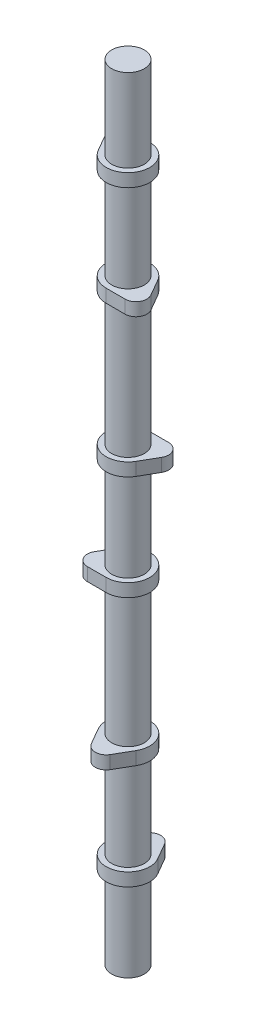
ISO-10303-21;
HEADER;
FILE_DESCRIPTION(('STEP AP214'),'2;1');
FILE_NAME('part.step','',(''),(''),'','','');
FILE_SCHEMA(('AUTOMOTIVE_DESIGN { 1 0 10303 214 1 1 1 1 }'));
ENDSEC;
DATA;
#1=APPLICATION_CONTEXT('core data for automotive mechanical design processes');
#2=APPLICATION_PROTOCOL_DEFINITION('international standard','automotive_design',2000,#1);
#3=PRODUCT_CONTEXT('',#1,'mechanical');
#4=PRODUCT('Part','Part','',(#3));
#5=PRODUCT_RELATED_PRODUCT_CATEGORY('part','',(#4));
#6=PRODUCT_DEFINITION_FORMATION('','',#4);
#7=PRODUCT_DEFINITION_CONTEXT('part definition',#1,'design');
#8=PRODUCT_DEFINITION('design','',#6,#7);
#9=PRODUCT_DEFINITION_SHAPE('','',#8);
#10=(LENGTH_UNIT() NAMED_UNIT(*) SI_UNIT(.MILLI.,.METRE.));
#11=(NAMED_UNIT(*) PLANE_ANGLE_UNIT() SI_UNIT($,.RADIAN.));
#12=(NAMED_UNIT(*) SI_UNIT($,.STERADIAN.) SOLID_ANGLE_UNIT());
#13=UNCERTAINTY_MEASURE_WITH_UNIT(LENGTH_MEASURE(1.E-05),#10,'distance_accuracy_value','');
#14=(GEOMETRIC_REPRESENTATION_CONTEXT(3) GLOBAL_UNCERTAINTY_ASSIGNED_CONTEXT((#13)) GLOBAL_UNIT_ASSIGNED_CONTEXT((#10,
#11,#12)) REPRESENTATION_CONTEXT('',''));
#15=CARTESIAN_POINT('',(0.,0.,0.));
#16=DIRECTION('',(0.,0.,1.));
#17=DIRECTION('',(1.,0.,0.));
#18=AXIS2_PLACEMENT_3D('',#15,#16,#17);
#19=CARTESIAN_POINT('',(0.,405.13,0.));
#20=DIRECTION('',(0.,-1.,0.));
#21=DIRECTION('',(0.,0.,-1.));
#22=AXIS2_PLACEMENT_3D('',#19,#20,#21);
#23=CYLINDRICAL_SURFACE('',#22,9.5);
#24=CARTESIAN_POINT('',(0.,210.82,0.));
#25=DIRECTION('',(0.,1.,0.));
#26=DIRECTION('',(0.,0.,1.));
#27=AXIS2_PLACEMENT_3D('',#24,#25,#26);
#28=CIRCLE('',#27,9.5);
#29=CARTESIAN_POINT('',(0.,210.82,9.5));
#30=VERTEX_POINT('',#29);
#31=EDGE_CURVE('E302',#30,#30,#28,.T.);
#32=ORIENTED_EDGE('',*,*,#31,.T.);
#33=EDGE_LOOP('',(#32));
#34=FACE_BOUND('',#33,.T.);
#35=CARTESIAN_POINT('',(0.,288.29,0.));
#36=DIRECTION('',(0.,1.,0.));
#37=DIRECTION('',(0.,0.,1.));
#38=AXIS2_PLACEMENT_3D('',#35,#36,#37);
#39=CIRCLE('',#38,9.5);
#40=CARTESIAN_POINT('',(0.,288.29,9.5));
#41=VERTEX_POINT('',#40);
#42=EDGE_CURVE('E11',#41,#41,#39,.T.);
#43=ORIENTED_EDGE('',*,*,#42,.F.);
#44=EDGE_LOOP('',(#43));
#45=FACE_BOUND('',#44,.T.);
#46=ADVANCED_FACE('F37',(#34,#45),#23,.T.);
#47=CARTESIAN_POINT('',(0.,149.86,0.));
#48=DIRECTION('',(0.,1.,0.));
#49=DIRECTION('',(0.,0.,1.));
#50=AXIS2_PLACEMENT_3D('',#47,#48,#49);
#51=CIRCLE('',#50,9.5);
#52=CARTESIAN_POINT('',(0.,149.86,9.5));
#53=VERTEX_POINT('',#52);
#54=EDGE_CURVE('E333',#53,#53,#51,.T.);
#55=ORIENTED_EDGE('',*,*,#54,.T.);
#56=EDGE_LOOP('',(#55));
#57=FACE_BOUND('',#56,.T.);
#58=CARTESIAN_POINT('',(0.,203.2,0.));
#59=DIRECTION('',(0.,1.,0.));
#60=DIRECTION('',(0.,0.,1.));
#61=AXIS2_PLACEMENT_3D('',#58,#59,#60);
#62=CIRCLE('',#61,9.5);
#63=CARTESIAN_POINT('',(0.,203.2,9.5));
#64=VERTEX_POINT('',#63);
#65=EDGE_CURVE('E406',#64,#64,#62,.T.);
#66=ORIENTED_EDGE('',*,*,#65,.F.);
#67=EDGE_LOOP('',(#66));
#68=FACE_BOUND('',#67,.T.);
#69=ADVANCED_FACE('F455',(#57,#68),#23,.T.);
#70=CARTESIAN_POINT('',(0.,64.77,0.));
#71=DIRECTION('',(0.,1.,0.));
#72=DIRECTION('',(0.,0.,1.));
#73=AXIS2_PLACEMENT_3D('',#70,#71,#72);
#74=CIRCLE('',#73,9.5);
#75=CARTESIAN_POINT('',(0.,64.77,9.5));
#76=VERTEX_POINT('',#75);
#77=EDGE_CURVE('E364',#76,#76,#74,.T.);
#78=ORIENTED_EDGE('',*,*,#77,.T.);
#79=EDGE_LOOP('',(#78));
#80=FACE_BOUND('',#79,.T.);
#81=CARTESIAN_POINT('',(0.,142.24,0.));
#82=DIRECTION('',(0.,1.,0.));
#83=DIRECTION('',(0.,0.,1.));
#84=AXIS2_PLACEMENT_3D('',#81,#82,#83);
#85=CIRCLE('',#84,9.5);
#86=CARTESIAN_POINT('',(0.,142.24,9.5));
#87=VERTEX_POINT('',#86);
#88=EDGE_CURVE('E401',#87,#87,#85,.T.);
#89=ORIENTED_EDGE('',*,*,#88,.F.);
#90=EDGE_LOOP('',(#89));
#91=FACE_BOUND('',#90,.T.);
#92=ADVANCED_FACE('F464',(#80,#91),#23,.T.);
#93=CARTESIAN_POINT('',(0.,3.80999999999998,0.));
#94=DIRECTION('',(0.,1.,0.));
#95=DIRECTION('',(0.,0.,1.));
#96=AXIS2_PLACEMENT_3D('',#93,#94,#95);
#97=CIRCLE('',#96,9.5);
#98=CARTESIAN_POINT('',(0.,3.80999999999998,9.5));
#99=VERTEX_POINT('',#98);
#100=EDGE_CURVE('E368',#99,#99,#97,.F.);
#101=ORIENTED_EDGE('',*,*,#100,.F.);
#102=EDGE_LOOP('',(#101));
#103=FACE_BOUND('',#102,.T.);
#104=CARTESIAN_POINT('',(0.,57.15,0.));
#105=DIRECTION('',(0.,1.,0.));
#106=DIRECTION('',(0.,0.,1.));
#107=AXIS2_PLACEMENT_3D('',#104,#105,#106);
#108=CIRCLE('',#107,9.5);
#109=CARTESIAN_POINT('',(0.,57.15,9.5));
#110=VERTEX_POINT('',#109);
#111=EDGE_CURVE('E398',#110,#110,#108,.T.);
#112=ORIENTED_EDGE('',*,*,#111,.F.);
#113=EDGE_LOOP('',(#112));
#114=FACE_BOUND('',#113,.T.);
#115=ADVANCED_FACE('F482',(#103,#114),#23,.T.);
#116=CARTESIAN_POINT('',(0.,3.81,-12.7));
#117=DIRECTION('',(0.,-1.,0.));
#118=DIRECTION('',(0.,0.,-1.));
#119=AXIS2_PLACEMENT_3D('',#116,#117,#118);
#120=CYLINDRICAL_SURFACE('',#119,6.35);
#121=CARTESIAN_POINT('',(0.,-3.81,-12.7));
#122=DIRECTION('',(0.,1.,0.));
#123=DIRECTION('',(0.,0.,1.));
#124=AXIS2_PLACEMENT_3D('',#121,#122,#123);
#125=CIRCLE('',#124,6.35);
#126=CARTESIAN_POINT('',(5.49926131403118,-3.81,-15.875));
#127=VERTEX_POINT('',#126);
#128=CARTESIAN_POINT('',(-5.49926131403119,-3.81,-15.875));
#129=VERTEX_POINT('',#128);
#130=EDGE_CURVE('E374',#127,#129,#125,.T.);
#131=ORIENTED_EDGE('',*,*,#130,.T.);
#132=DIRECTION('',(0.,-1.,0.));
#133=VECTOR('',#132,1.);
#134=CARTESIAN_POINT('',(-5.49926131403119,3.81,-15.875));
#135=LINE('',#134,#133);
#136=CARTESIAN_POINT('',(-5.49926131403119,3.81,-15.875));
#137=VERTEX_POINT('',#136);
#138=EDGE_CURVE('E393',#137,#129,#135,.T.);
#139=ORIENTED_EDGE('',*,*,#138,.F.);
#140=CARTESIAN_POINT('',(0.,3.81,-12.7));
#141=DIRECTION('',(0.,1.,0.));
#142=DIRECTION('',(0.,0.,1.));
#143=AXIS2_PLACEMENT_3D('',#140,#141,#142);
#144=CIRCLE('',#143,6.35);
#145=CARTESIAN_POINT('',(5.49926131403118,3.81,-15.875));
#146=VERTEX_POINT('',#145);
#147=EDGE_CURVE('E375',#146,#137,#144,.T.);
#148=ORIENTED_EDGE('',*,*,#147,.F.);
#149=DIRECTION('',(0.,-1.,0.));
#150=VECTOR('',#149,1.);
#151=CARTESIAN_POINT('',(5.49926131403118,3.81,-15.875));
#152=LINE('',#151,#150);
#153=EDGE_CURVE('E381',#146,#127,#152,.T.);
#154=ORIENTED_EDGE('',*,*,#153,.T.);
#155=EDGE_LOOP('',(#131,#139,#148,#154));
#156=FACE_BOUND('',#155,.T.);
#157=ADVANCED_FACE('F39',(#156),#120,.T.);
#158=CARTESIAN_POINT('',(-5.49926131403119,3.81,-15.875));
#159=DIRECTION('',(0.866025403784439,0.,0.5));
#160=DIRECTION('',(0.5,0.,-0.866025403784439));
#161=AXIS2_PLACEMENT_3D('',#158,#159,#160);
#162=PLANE('',#161);
#163=DIRECTION('',(-0.5,0.,0.866025403784439));
#164=VECTOR('',#163,1.);
#165=CARTESIAN_POINT('',(-5.49926131403119,-3.81,-15.875));
#166=LINE('',#165,#164);
#167=CARTESIAN_POINT('',(-10.9985226280624,-3.81,-6.34999999999999));
#168=VERTEX_POINT('',#167);
#169=EDGE_CURVE('E384',#129,#168,#166,.T.);
#170=ORIENTED_EDGE('',*,*,#169,.T.);
#171=DIRECTION('',(0.,-1.,0.));
#172=VECTOR('',#171,1.);
#173=CARTESIAN_POINT('',(-10.9985226280624,3.81,-6.34999999999999));
#174=LINE('',#173,#172);
#175=CARTESIAN_POINT('',(-10.9985226280624,3.81,-6.34999999999999));
#176=VERTEX_POINT('',#175);
#177=EDGE_CURVE('E391',#176,#168,#174,.T.);
#178=ORIENTED_EDGE('',*,*,#177,.F.);
#179=DIRECTION('',(-0.5,0.,0.866025403784439));
#180=VECTOR('',#179,1.);
#181=CARTESIAN_POINT('',(-5.49926131403119,3.81,-15.875));
#182=LINE('',#181,#180);
#183=EDGE_CURVE('E87',#137,#176,#182,.T.);
#184=ORIENTED_EDGE('',*,*,#183,.F.);
#185=ORIENTED_EDGE('',*,*,#138,.T.);
#186=EDGE_LOOP('',(#170,#178,#184,#185));
#187=FACE_BOUND('',#186,.T.);
#188=ADVANCED_FACE('F500',(#187),#162,.F.);
#189=CARTESIAN_POINT('',(0.,3.81,0.));
#190=DIRECTION('',(0.,-1.,0.));
#191=DIRECTION('',(0.,0.,-1.));
#192=AXIS2_PLACEMENT_3D('',#189,#190,#191);
#193=CYLINDRICAL_SURFACE('',#192,12.7);
#194=CARTESIAN_POINT('',(0.,-3.81,0.));
#195=DIRECTION('',(0.,1.,0.));
#196=DIRECTION('',(0.,0.,1.));
#197=AXIS2_PLACEMENT_3D('',#194,#195,#196);
#198=CIRCLE('',#197,12.7);
#199=CARTESIAN_POINT('',(10.9985226280624,-3.81,-6.35));
#200=VERTEX_POINT('',#199);
#201=EDGE_CURVE('E73',#168,#200,#198,.T.);
#202=ORIENTED_EDGE('',*,*,#201,.T.);
#203=DIRECTION('',(0.,-1.,0.));
#204=VECTOR('',#203,1.);
#205=CARTESIAN_POINT('',(10.9985226280624,3.81,-6.35));
#206=LINE('',#205,#204);
#207=CARTESIAN_POINT('',(10.9985226280624,3.81,-6.35));
#208=VERTEX_POINT('',#207);
#209=EDGE_CURVE('E389',#208,#200,#206,.T.);
#210=ORIENTED_EDGE('',*,*,#209,.F.);
#211=CARTESIAN_POINT('',(0.,3.81,0.));
#212=DIRECTION('',(0.,1.,0.));
#213=DIRECTION('',(0.,0.,1.));
#214=AXIS2_PLACEMENT_3D('',#211,#212,#213);
#215=CIRCLE('',#214,12.7);
#216=EDGE_CURVE('E378',#176,#208,#215,.T.);
#217=ORIENTED_EDGE('',*,*,#216,.F.);
#218=ORIENTED_EDGE('',*,*,#177,.T.);
#219=EDGE_LOOP('',(#202,#210,#217,#218));
#220=FACE_BOUND('',#219,.T.);
#221=ADVANCED_FACE('F771',(#220),#193,.T.);
#222=CARTESIAN_POINT('',(5.49926131403118,3.81,-15.875));
#223=DIRECTION('',(-0.866025403784439,0.,0.5));
#224=DIRECTION('',(0.5,0.,0.866025403784439));
#225=AXIS2_PLACEMENT_3D('',#222,#223,#224);
#226=PLANE('',#225);
#227=DIRECTION('',(-0.5,0.,-0.866025403784439));
#228=VECTOR('',#227,1.);
#229=CARTESIAN_POINT('',(5.49926131403118,-3.81,-15.875));
#230=LINE('',#229,#228);
#231=EDGE_CURVE('E79',#200,#127,#230,.T.);
#232=ORIENTED_EDGE('',*,*,#231,.T.);
#233=ORIENTED_EDGE('',*,*,#153,.F.);
#234=DIRECTION('',(-0.5,0.,-0.866025403784439));
#235=VECTOR('',#234,1.);
#236=CARTESIAN_POINT('',(5.49926131403118,3.81,-15.875));
#237=LINE('',#236,#235);
#238=EDGE_CURVE('E55',#208,#146,#237,.T.);
#239=ORIENTED_EDGE('',*,*,#238,.F.);
#240=ORIENTED_EDGE('',*,*,#209,.T.);
#241=EDGE_LOOP('',(#232,#233,#239,#240));
#242=FACE_BOUND('',#241,.T.);
#243=ADVANCED_FACE('F763',(#242),#226,.F.);
#244=CARTESIAN_POINT('',(0.,3.81,-12.7));
#245=DIRECTION('',(0.,1.,0.));
#246=DIRECTION('',(0.,0.,1.));
#247=AXIS2_PLACEMENT_3D('',#244,#245,#246);
#248=PLANE('',#247);
#249=ORIENTED_EDGE('',*,*,#100,.T.);
#250=EDGE_LOOP('',(#249));
#251=FACE_BOUND('',#250,.T.);
#252=ORIENTED_EDGE('',*,*,#147,.T.);
#253=ORIENTED_EDGE('',*,*,#183,.T.);
#254=ORIENTED_EDGE('',*,*,#216,.T.);
#255=ORIENTED_EDGE('',*,*,#238,.T.);
#256=EDGE_LOOP('',(#252,#253,#254,#255));
#257=FACE_BOUND('',#256,.T.);
#258=ADVANCED_FACE('F756',(#251,#257),#248,.T.);
#259=CARTESIAN_POINT('',(0.,-3.81,-12.7));
#260=DIRECTION('',(0.,1.,0.));
#261=DIRECTION('',(0.,0.,1.));
#262=AXIS2_PLACEMENT_3D('',#259,#260,#261);
#263=PLANE('',#262);
#264=CARTESIAN_POINT('',(0.,-3.80999999999998,0.));
#265=DIRECTION('',(0.,1.,0.));
#266=DIRECTION('',(0.,0.,1.));
#267=AXIS2_PLACEMENT_3D('',#264,#265,#266);
#268=CIRCLE('',#267,9.5);
#269=CARTESIAN_POINT('',(0.,-3.80999999999998,9.5));
#270=VERTEX_POINT('',#269);
#271=EDGE_CURVE('E395',#270,#270,#268,.F.);
#272=ORIENTED_EDGE('',*,*,#271,.F.);
#273=EDGE_LOOP('',(#272));
#274=FACE_BOUND('',#273,.T.);
#275=ORIENTED_EDGE('',*,*,#130,.F.);
#276=ORIENTED_EDGE('',*,*,#231,.F.);
#277=ORIENTED_EDGE('',*,*,#201,.F.);
#278=ORIENTED_EDGE('',*,*,#169,.F.);
#279=EDGE_LOOP('',(#275,#276,#277,#278));
#280=FACE_BOUND('',#279,.T.);
#281=ADVANCED_FACE('F490',(#274,#280),#263,.F.);
#282=CARTESIAN_POINT('',(0.,-52.02,0.));
#283=DIRECTION('',(0.,1.,0.));
#284=DIRECTION('',(0.,0.,1.));
#285=AXIS2_PLACEMENT_3D('',#282,#283,#284);
#286=PLANE('',#285);
#287=CARTESIAN_POINT('',(0.,-52.02,0.));
#288=DIRECTION('',(0.,1.,0.));
#289=DIRECTION('',(0.,0.,1.));
#290=AXIS2_PLACEMENT_3D('',#287,#288,#289);
#291=CIRCLE('',#290,9.5);
#292=CARTESIAN_POINT('',(0.,-52.02,9.5));
#293=VERTEX_POINT('',#292);
#294=EDGE_CURVE('E369',#293,#293,#291,.T.);
#295=ORIENTED_EDGE('',*,*,#294,.F.);
#296=EDGE_LOOP('',(#295));
#297=FACE_BOUND('',#296,.T.);
#298=ADVANCED_FACE('F480',(#297),#286,.F.);
#299=ORIENTED_EDGE('',*,*,#294,.T.);
#300=EDGE_LOOP('',(#299));
#301=FACE_BOUND('',#300,.T.);
#302=ORIENTED_EDGE('',*,*,#271,.T.);
#303=EDGE_LOOP('',(#302));
#304=FACE_BOUND('',#303,.T.);
#305=ADVANCED_FACE('F471',(#301,#304),#23,.T.);
#306=CARTESIAN_POINT('',(0.,64.77,12.7));
#307=DIRECTION('',(0.,-1.,0.));
#308=DIRECTION('',(0.,0.,1.));
#309=AXIS2_PLACEMENT_3D('',#306,#307,#308);
#310=CYLINDRICAL_SURFACE('',#309,6.35);
#311=CARTESIAN_POINT('',(0.,57.15,12.7));
#312=DIRECTION('',(0.,1.,0.));
#313=DIRECTION('',(0.,0.,-1.));
#314=AXIS2_PLACEMENT_3D('',#311,#312,#313);
#315=CIRCLE('',#314,6.35);
#316=CARTESIAN_POINT('',(-5.4992613140313,57.15,15.875));
#317=VERTEX_POINT('',#316);
#318=CARTESIAN_POINT('',(5.49926131403107,57.15,15.875));
#319=VERTEX_POINT('',#318);
#320=EDGE_CURVE('E345',#317,#319,#315,.T.);
#321=ORIENTED_EDGE('',*,*,#320,.T.);
#322=DIRECTION('',(0.,-1.,0.));
#323=VECTOR('',#322,1.);
#324=CARTESIAN_POINT('',(5.49926131403107,64.77,15.875));
#325=LINE('',#324,#323);
#326=CARTESIAN_POINT('',(5.49926131403107,64.77,15.875));
#327=VERTEX_POINT('',#326);
#328=EDGE_CURVE('E361',#327,#319,#325,.T.);
#329=ORIENTED_EDGE('',*,*,#328,.F.);
#330=CARTESIAN_POINT('',(0.,64.77,12.7));
#331=DIRECTION('',(0.,1.,0.));
#332=DIRECTION('',(0.,0.,-1.));
#333=AXIS2_PLACEMENT_3D('',#330,#331,#332);
#334=CIRCLE('',#333,6.35);
#335=CARTESIAN_POINT('',(-5.4992613140313,64.77,15.875));
#336=VERTEX_POINT('',#335);
#337=EDGE_CURVE('E334',#336,#327,#334,.T.);
#338=ORIENTED_EDGE('',*,*,#337,.F.);
#339=DIRECTION('',(0.,-1.,0.));
#340=VECTOR('',#339,1.);
#341=CARTESIAN_POINT('',(-5.4992613140313,64.77,15.875));
#342=LINE('',#341,#340);
#343=EDGE_CURVE('E344',#336,#317,#342,.T.);
#344=ORIENTED_EDGE('',*,*,#343,.T.);
#345=EDGE_LOOP('',(#321,#329,#338,#344));
#346=FACE_BOUND('',#345,.T.);
#347=ADVANCED_FACE('F479',(#346),#310,.T.);
#348=CARTESIAN_POINT('',(5.49926131403107,64.77,15.875));
#349=DIRECTION('',(-0.866025403784435,0.,-0.500000000000006));
#350=DIRECTION('',(-0.500000000000006,0.,0.866025403784435));
#351=AXIS2_PLACEMENT_3D('',#348,#349,#350);
#352=PLANE('',#351);
#353=DIRECTION('',(0.500000000000006,0.,-0.866025403784435));
#354=VECTOR('',#353,1.);
#355=CARTESIAN_POINT('',(5.49926131403107,57.15,15.875));
#356=LINE('',#355,#354);
#357=CARTESIAN_POINT('',(10.9985226280623,57.15,6.35000000000007));
#358=VERTEX_POINT('',#357);
#359=EDGE_CURVE('E348',#319,#358,#356,.T.);
#360=ORIENTED_EDGE('',*,*,#359,.T.);
#361=DIRECTION('',(0.,-1.,0.));
#362=VECTOR('',#361,1.);
#363=CARTESIAN_POINT('',(10.9985226280623,64.77,6.35000000000007));
#364=LINE('',#363,#362);
#365=CARTESIAN_POINT('',(10.9985226280623,64.77,6.35000000000007));
#366=VERTEX_POINT('',#365);
#367=EDGE_CURVE('E358',#366,#358,#364,.T.);
#368=ORIENTED_EDGE('',*,*,#367,.F.);
#369=DIRECTION('',(0.500000000000006,0.,-0.866025403784435));
#370=VECTOR('',#369,1.);
#371=CARTESIAN_POINT('',(5.49926131403107,64.77,15.875));
#372=LINE('',#371,#370);
#373=EDGE_CURVE('E337',#327,#366,#372,.T.);
#374=ORIENTED_EDGE('',*,*,#373,.F.);
#375=ORIENTED_EDGE('',*,*,#328,.T.);
#376=EDGE_LOOP('',(#360,#368,#374,#375));
#377=FACE_BOUND('',#376,.T.);
#378=ADVANCED_FACE('F487',(#377),#352,.F.);
#379=CARTESIAN_POINT('',(0.,64.77,0.));
#380=DIRECTION('',(0.,-1.,0.));
#381=DIRECTION('',(0.,0.,1.));
#382=AXIS2_PLACEMENT_3D('',#379,#380,#381);
#383=CYLINDRICAL_SURFACE('',#382,12.7);
#384=CARTESIAN_POINT('',(0.,57.15,0.));
#385=DIRECTION('',(0.,1.,0.));
#386=DIRECTION('',(0.,0.,-1.));
#387=AXIS2_PLACEMENT_3D('',#384,#385,#386);
#388=CIRCLE('',#387,12.7);
#389=CARTESIAN_POINT('',(-10.9985226280624,57.15,6.34999999999992));
#390=VERTEX_POINT('',#389);
#391=EDGE_CURVE('E350',#358,#390,#388,.T.);
#392=ORIENTED_EDGE('',*,*,#391,.T.);
#393=DIRECTION('',(0.,-1.,0.));
#394=VECTOR('',#393,1.);
#395=CARTESIAN_POINT('',(-10.9985226280624,64.77,6.34999999999992));
#396=LINE('',#395,#394);
#397=CARTESIAN_POINT('',(-10.9985226280624,64.77,6.34999999999992));
#398=VERTEX_POINT('',#397);
#399=EDGE_CURVE('E355',#398,#390,#396,.T.);
#400=ORIENTED_EDGE('',*,*,#399,.F.);
#401=CARTESIAN_POINT('',(0.,64.77,0.));
#402=DIRECTION('',(0.,1.,0.));
#403=DIRECTION('',(0.,0.,-1.));
#404=AXIS2_PLACEMENT_3D('',#401,#402,#403);
#405=CIRCLE('',#404,12.7);
#406=EDGE_CURVE('E340',#366,#398,#405,.T.);
#407=ORIENTED_EDGE('',*,*,#406,.F.);
#408=ORIENTED_EDGE('',*,*,#367,.T.);
#409=EDGE_LOOP('',(#392,#400,#407,#408));
#410=FACE_BOUND('',#409,.T.);
#411=ADVANCED_FACE('F525',(#410),#383,.T.);
#412=CARTESIAN_POINT('',(-5.4992613140313,64.77,15.875));
#413=DIRECTION('',(0.866025403784442,0.,-0.499999999999994));
#414=DIRECTION('',(-0.499999999999994,0.,-0.866025403784442));
#415=AXIS2_PLACEMENT_3D('',#412,#413,#414);
#416=PLANE('',#415);
#417=DIRECTION('',(0.499999999999994,0.,0.866025403784442));
#418=VECTOR('',#417,1.);
#419=CARTESIAN_POINT('',(-5.4992613140313,57.15,15.875));
#420=LINE('',#419,#418);
#421=EDGE_CURVE('E338',#390,#317,#420,.T.);
#422=ORIENTED_EDGE('',*,*,#421,.T.);
#423=ORIENTED_EDGE('',*,*,#343,.F.);
#424=DIRECTION('',(0.499999999999994,0.,0.866025403784442));
#425=VECTOR('',#424,1.);
#426=CARTESIAN_POINT('',(-5.4992613140313,64.77,15.875));
#427=LINE('',#426,#425);
#428=EDGE_CURVE('E342',#398,#336,#427,.T.);
#429=ORIENTED_EDGE('',*,*,#428,.F.);
#430=ORIENTED_EDGE('',*,*,#399,.T.);
#431=EDGE_LOOP('',(#422,#423,#429,#430));
#432=FACE_BOUND('',#431,.T.);
#433=ADVANCED_FACE('F521',(#432),#416,.F.);
#434=CARTESIAN_POINT('',(0.,64.77,12.7));
#435=DIRECTION('',(0.,1.,0.));
#436=DIRECTION('',(0.,0.,-1.));
#437=AXIS2_PLACEMENT_3D('',#434,#435,#436);
#438=PLANE('',#437);
#439=ORIENTED_EDGE('',*,*,#77,.F.);
#440=EDGE_LOOP('',(#439));
#441=FACE_BOUND('',#440,.T.);
#442=ORIENTED_EDGE('',*,*,#337,.T.);
#443=ORIENTED_EDGE('',*,*,#373,.T.);
#444=ORIENTED_EDGE('',*,*,#406,.T.);
#445=ORIENTED_EDGE('',*,*,#428,.T.);
#446=EDGE_LOOP('',(#442,#443,#444,#445));
#447=FACE_BOUND('',#446,.T.);
#448=ADVANCED_FACE('F511',(#441,#447),#438,.T.);
#449=CARTESIAN_POINT('',(0.,57.15,12.7));
#450=DIRECTION('',(0.,1.,0.));
#451=DIRECTION('',(0.,0.,-1.));
#452=AXIS2_PLACEMENT_3D('',#449,#450,#451);
#453=PLANE('',#452);
#454=ORIENTED_EDGE('',*,*,#111,.T.);
#455=EDGE_LOOP('',(#454));
#456=FACE_BOUND('',#455,.T.);
#457=ORIENTED_EDGE('',*,*,#320,.F.);
#458=ORIENTED_EDGE('',*,*,#421,.F.);
#459=ORIENTED_EDGE('',*,*,#391,.F.);
#460=ORIENTED_EDGE('',*,*,#359,.F.);
#461=EDGE_LOOP('',(#457,#458,#459,#460));
#462=FACE_BOUND('',#461,.T.);
#463=ADVANCED_FACE('F507',(#456,#462),#453,.F.);
#464=CARTESIAN_POINT('',(-10.9985226280623,149.86,6.35000000000005));
#465=DIRECTION('',(0.,-1.,0.));
#466=DIRECTION('',(-0.866025403784436,0.,0.500000000000004));
#467=AXIS2_PLACEMENT_3D('',#464,#465,#466);
#468=CYLINDRICAL_SURFACE('',#467,6.35);
#469=CARTESIAN_POINT('',(-10.9985226280623,142.24,6.35000000000005));
#470=DIRECTION('',(0.,1.,0.));
#471=DIRECTION('',(0.866025403784436,0.,-0.500000000000004));
#472=AXIS2_PLACEMENT_3D('',#469,#470,#471);
#473=CIRCLE('',#472,6.35);
#474=CARTESIAN_POINT('',(-16.4977839420935,142.24,3.17500000000008));
#475=VERTEX_POINT('',#474);
#476=CARTESIAN_POINT('',(-10.9985226280623,142.24,12.7000000000001));
#477=VERTEX_POINT('',#476);
#478=EDGE_CURVE('E314',#475,#477,#473,.T.);
#479=ORIENTED_EDGE('',*,*,#478,.T.);
#480=DIRECTION('',(0.,-1.,0.));
#481=VECTOR('',#480,1.);
#482=CARTESIAN_POINT('',(-10.9985226280623,149.86,12.7000000000001));
#483=LINE('',#482,#481);
#484=CARTESIAN_POINT('',(-10.9985226280623,149.86,12.7000000000001));
#485=VERTEX_POINT('',#484);
#486=EDGE_CURVE('E330',#485,#477,#483,.T.);
#487=ORIENTED_EDGE('',*,*,#486,.F.);
#488=CARTESIAN_POINT('',(-10.9985226280623,149.86,6.35000000000005));
#489=DIRECTION('',(0.,1.,0.));
#490=DIRECTION('',(0.866025403784436,0.,-0.500000000000004));
#491=AXIS2_PLACEMENT_3D('',#488,#489,#490);
#492=CIRCLE('',#491,6.35);
#493=CARTESIAN_POINT('',(-16.4977839420935,149.86,3.17500000000008));
#494=VERTEX_POINT('',#493);
#495=EDGE_CURVE('E303',#494,#485,#492,.T.);
#496=ORIENTED_EDGE('',*,*,#495,.F.);
#497=DIRECTION('',(0.,-1.,0.));
#498=VECTOR('',#497,1.);
#499=CARTESIAN_POINT('',(-16.4977839420935,149.86,3.17500000000008));
#500=LINE('',#499,#498);
#501=EDGE_CURVE('E313',#494,#475,#500,.T.);
#502=ORIENTED_EDGE('',*,*,#501,.T.);
#503=EDGE_LOOP('',(#479,#487,#496,#502));
#504=FACE_BOUND('',#503,.T.);
#505=ADVANCED_FACE('F510',(#504),#468,.T.);
#506=CARTESIAN_POINT('',(-10.9985226280623,149.86,12.7000000000001));
#507=DIRECTION('',(0.,0.,-1.));
#508=DIRECTION('',(-1.,0.,0.));
#509=AXIS2_PLACEMENT_3D('',#506,#507,#508);
#510=PLANE('',#509);
#511=DIRECTION('',(1.,0.,0.));
#512=VECTOR('',#511,1.);
#513=CARTESIAN_POINT('',(-10.9985226280623,142.24,12.7000000000001));
#514=LINE('',#513,#512);
#515=CARTESIAN_POINT('',(0.,142.24,12.7));
#516=VERTEX_POINT('',#515);
#517=EDGE_CURVE('E317',#477,#516,#514,.T.);
#518=ORIENTED_EDGE('',*,*,#517,.T.);
#519=DIRECTION('',(0.,-1.,0.));
#520=VECTOR('',#519,1.);
#521=CARTESIAN_POINT('',(0.,149.86,12.7));
#522=LINE('',#521,#520);
#523=CARTESIAN_POINT('',(0.,149.86,12.7));
#524=VERTEX_POINT('',#523);
#525=EDGE_CURVE('E327',#524,#516,#522,.T.);
#526=ORIENTED_EDGE('',*,*,#525,.F.);
#527=DIRECTION('',(1.,0.,0.));
#528=VECTOR('',#527,1.);
#529=CARTESIAN_POINT('',(-10.9985226280623,149.86,12.7000000000001));
#530=LINE('',#529,#528);
#531=EDGE_CURVE('E306',#485,#524,#530,.T.);
#532=ORIENTED_EDGE('',*,*,#531,.F.);
#533=ORIENTED_EDGE('',*,*,#486,.T.);
#534=EDGE_LOOP('',(#518,#526,#532,#533));
#535=FACE_BOUND('',#534,.T.);
#536=ADVANCED_FACE('F568',(#535),#510,.F.);
#537=CARTESIAN_POINT('',(0.,149.86,0.));
#538=DIRECTION('',(0.,-1.,0.));
#539=DIRECTION('',(-0.866025403784436,0.,0.500000000000004));
#540=AXIS2_PLACEMENT_3D('',#537,#538,#539);
#541=CYLINDRICAL_SURFACE('',#540,12.7);
#542=CARTESIAN_POINT('',(0.,142.24,0.));
#543=DIRECTION('',(0.,1.,0.));
#544=DIRECTION('',(0.866025403784436,0.,-0.500000000000004));
#545=AXIS2_PLACEMENT_3D('',#542,#543,#544);
#546=CIRCLE('',#545,12.7);
#547=CARTESIAN_POINT('',(-10.9985226280624,142.24,-6.34999999999995));
#548=VERTEX_POINT('',#547);
#549=EDGE_CURVE('E319',#516,#548,#546,.T.);
#550=ORIENTED_EDGE('',*,*,#549,.T.);
#551=DIRECTION('',(0.,-1.,0.));
#552=VECTOR('',#551,1.);
#553=CARTESIAN_POINT('',(-10.9985226280624,149.86,-6.34999999999995));
#554=LINE('',#553,#552);
#555=CARTESIAN_POINT('',(-10.9985226280624,149.86,-6.34999999999995));
#556=VERTEX_POINT('',#555);
#557=EDGE_CURVE('E324',#556,#548,#554,.T.);
#558=ORIENTED_EDGE('',*,*,#557,.F.);
#559=CARTESIAN_POINT('',(0.,149.86,0.));
#560=DIRECTION('',(0.,1.,0.));
#561=DIRECTION('',(0.866025403784436,0.,-0.500000000000004));
#562=AXIS2_PLACEMENT_3D('',#559,#560,#561);
#563=CIRCLE('',#562,12.7);
#564=EDGE_CURVE('E309',#524,#556,#563,.T.);
#565=ORIENTED_EDGE('',*,*,#564,.F.);
#566=ORIENTED_EDGE('',*,*,#525,.T.);
#567=EDGE_LOOP('',(#550,#558,#565,#566));
#568=FACE_BOUND('',#567,.T.);
#569=ADVANCED_FACE('F575',(#568),#541,.T.);
#570=CARTESIAN_POINT('',(-16.4977839420935,149.86,3.17500000000008));
#571=DIRECTION('',(0.866025403784441,0.,0.499999999999996));
#572=DIRECTION('',(0.499999999999996,0.,-0.866025403784441));
#573=AXIS2_PLACEMENT_3D('',#570,#571,#572);
#574=PLANE('',#573);
#575=DIRECTION('',(-0.499999999999996,0.,0.866025403784441));
#576=VECTOR('',#575,1.);
#577=CARTESIAN_POINT('',(-16.4977839420935,142.24,3.17500000000008));
#578=LINE('',#577,#576);
#579=EDGE_CURVE('E307',#548,#475,#578,.T.);
#580=ORIENTED_EDGE('',*,*,#579,.T.);
#581=ORIENTED_EDGE('',*,*,#501,.F.);
#582=DIRECTION('',(-0.499999999999996,0.,0.866025403784441));
#583=VECTOR('',#582,1.);
#584=CARTESIAN_POINT('',(-16.4977839420935,149.86,3.17500000000008));
#585=LINE('',#584,#583);
#586=EDGE_CURVE('E311',#556,#494,#585,.T.);
#587=ORIENTED_EDGE('',*,*,#586,.F.);
#588=ORIENTED_EDGE('',*,*,#557,.T.);
#589=EDGE_LOOP('',(#580,#581,#587,#588));
#590=FACE_BOUND('',#589,.T.);
#591=ADVANCED_FACE('F582',(#590),#574,.F.);
#592=CARTESIAN_POINT('',(-10.9985226280623,149.86,6.35000000000005));
#593=DIRECTION('',(0.,1.,0.));
#594=DIRECTION('',(0.866025403784436,0.,-0.500000000000004));
#595=AXIS2_PLACEMENT_3D('',#592,#593,#594);
#596=PLANE('',#595);
#597=ORIENTED_EDGE('',*,*,#54,.F.);
#598=EDGE_LOOP('',(#597));
#599=FACE_BOUND('',#598,.T.);
#600=ORIENTED_EDGE('',*,*,#495,.T.);
#601=ORIENTED_EDGE('',*,*,#531,.T.);
#602=ORIENTED_EDGE('',*,*,#564,.T.);
#603=ORIENTED_EDGE('',*,*,#586,.T.);
#604=EDGE_LOOP('',(#600,#601,#602,#603));
#605=FACE_BOUND('',#604,.T.);
#606=ADVANCED_FACE('F590',(#599,#605),#596,.T.);
#607=CARTESIAN_POINT('',(-10.9985226280623,142.24,6.35000000000005));
#608=DIRECTION('',(0.,1.,0.));
#609=DIRECTION('',(0.866025403784436,0.,-0.500000000000004));
#610=AXIS2_PLACEMENT_3D('',#607,#608,#609);
#611=PLANE('',#610);
#612=ORIENTED_EDGE('',*,*,#88,.T.);
#613=EDGE_LOOP('',(#612));
#614=FACE_BOUND('',#613,.T.);
#615=ORIENTED_EDGE('',*,*,#478,.F.);
#616=ORIENTED_EDGE('',*,*,#579,.F.);
#617=ORIENTED_EDGE('',*,*,#549,.F.);
#618=ORIENTED_EDGE('',*,*,#517,.F.);
#619=EDGE_LOOP('',(#615,#616,#617,#618));
#620=FACE_BOUND('',#619,.T.);
#621=ADVANCED_FACE('F598',(#614,#620),#611,.F.);
#622=CARTESIAN_POINT('',(10.9985226280624,210.82,-6.34999999999997));
#623=DIRECTION('',(0.,-1.,0.));
#624=DIRECTION('',(0.86602540378444,0.,-0.499999999999998));
#625=AXIS2_PLACEMENT_3D('',#622,#623,#624);
#626=CYLINDRICAL_SURFACE('',#625,6.35);
#627=CARTESIAN_POINT('',(10.9985226280624,203.2,-6.34999999999997));
#628=DIRECTION('',(0.,1.,0.));
#629=DIRECTION('',(-0.86602540378444,0.,0.499999999999998));
#630=AXIS2_PLACEMENT_3D('',#627,#628,#629);
#631=CIRCLE('',#630,6.35);
#632=CARTESIAN_POINT('',(16.4977839420936,203.2,-3.17499999999996));
#633=VERTEX_POINT('',#632);
#634=CARTESIAN_POINT('',(10.9985226280624,203.2,-12.7));
#635=VERTEX_POINT('',#634);
#636=EDGE_CURVE('E283',#633,#635,#631,.T.);
#637=ORIENTED_EDGE('',*,*,#636,.T.);
#638=DIRECTION('',(0.,-1.,0.));
#639=VECTOR('',#638,1.);
#640=CARTESIAN_POINT('',(10.9985226280624,210.82,-12.7));
#641=LINE('',#640,#639);
#642=CARTESIAN_POINT('',(10.9985226280624,210.82,-12.7));
#643=VERTEX_POINT('',#642);
#644=EDGE_CURVE('E299',#643,#635,#641,.T.);
#645=ORIENTED_EDGE('',*,*,#644,.F.);
#646=CARTESIAN_POINT('',(10.9985226280624,210.82,-6.34999999999997));
#647=DIRECTION('',(0.,1.,0.));
#648=DIRECTION('',(-0.86602540378444,0.,0.499999999999998));
#649=AXIS2_PLACEMENT_3D('',#646,#647,#648);
#650=CIRCLE('',#649,6.35);
#651=CARTESIAN_POINT('',(16.4977839420936,210.82,-3.17499999999996));
#652=VERTEX_POINT('',#651);
#653=EDGE_CURVE('E272',#652,#643,#650,.T.);
#654=ORIENTED_EDGE('',*,*,#653,.F.);
#655=DIRECTION('',(0.,-1.,0.));
#656=VECTOR('',#655,1.);
#657=CARTESIAN_POINT('',(16.4977839420936,210.82,-3.17499999999996));
#658=LINE('',#657,#656);
#659=EDGE_CURVE('E282',#652,#633,#658,.T.);
#660=ORIENTED_EDGE('',*,*,#659,.T.);
#661=EDGE_LOOP('',(#637,#645,#654,#660));
#662=FACE_BOUND('',#661,.T.);
#663=ADVANCED_FACE('F606',(#662),#626,.T.);
#664=CARTESIAN_POINT('',(10.9985226280624,210.82,-12.7));
#665=DIRECTION('',(0.,0.,1.));
#666=DIRECTION('',(1.,0.,0.));
#667=AXIS2_PLACEMENT_3D('',#664,#665,#666);
#668=PLANE('',#667);
#669=DIRECTION('',(-1.,0.,0.));
#670=VECTOR('',#669,1.);
#671=CARTESIAN_POINT('',(10.9985226280624,203.2,-12.7));
#672=LINE('',#671,#670);
#673=CARTESIAN_POINT('',(0.,203.2,-12.7));
#674=VERTEX_POINT('',#673);
#675=EDGE_CURVE('E286',#635,#674,#672,.T.);
#676=ORIENTED_EDGE('',*,*,#675,.T.);
#677=DIRECTION('',(0.,-1.,0.));
#678=VECTOR('',#677,1.);
#679=CARTESIAN_POINT('',(0.,210.82,-12.7));
#680=LINE('',#679,#678);
#681=CARTESIAN_POINT('',(0.,210.82,-12.7));
#682=VERTEX_POINT('',#681);
#683=EDGE_CURVE('E296',#682,#674,#680,.T.);
#684=ORIENTED_EDGE('',*,*,#683,.F.);
#685=DIRECTION('',(-1.,0.,0.));
#686=VECTOR('',#685,1.);
#687=CARTESIAN_POINT('',(10.9985226280624,210.82,-12.7));
#688=LINE('',#687,#686);
#689=EDGE_CURVE('E275',#643,#682,#688,.T.);
#690=ORIENTED_EDGE('',*,*,#689,.F.);
#691=ORIENTED_EDGE('',*,*,#644,.T.);
#692=EDGE_LOOP('',(#676,#684,#690,#691));
#693=FACE_BOUND('',#692,.T.);
#694=ADVANCED_FACE('F614',(#693),#668,.F.);
#695=CARTESIAN_POINT('',(0.,210.82,0.));
#696=DIRECTION('',(0.,-1.,0.));
#697=DIRECTION('',(0.86602540378444,0.,-0.499999999999998));
#698=AXIS2_PLACEMENT_3D('',#695,#696,#697);
#699=CYLINDRICAL_SURFACE('',#698,12.7);
#700=CARTESIAN_POINT('',(0.,203.2,0.));
#701=DIRECTION('',(0.,1.,0.));
#702=DIRECTION('',(-0.86602540378444,0.,0.499999999999998));
#703=AXIS2_PLACEMENT_3D('',#700,#701,#702);
#704=CIRCLE('',#703,12.7);
#705=CARTESIAN_POINT('',(10.9985226280624,203.2,6.35000000000003));
#706=VERTEX_POINT('',#705);
#707=EDGE_CURVE('E288',#674,#706,#704,.T.);
#708=ORIENTED_EDGE('',*,*,#707,.T.);
#709=DIRECTION('',(0.,-1.,0.));
#710=VECTOR('',#709,1.);
#711=CARTESIAN_POINT('',(10.9985226280624,210.82,6.35000000000003));
#712=LINE('',#711,#710);
#713=CARTESIAN_POINT('',(10.9985226280624,210.82,6.35000000000003));
#714=VERTEX_POINT('',#713);
#715=EDGE_CURVE('E293',#714,#706,#712,.T.);
#716=ORIENTED_EDGE('',*,*,#715,.F.);
#717=CARTESIAN_POINT('',(0.,210.82,0.));
#718=DIRECTION('',(0.,1.,0.));
#719=DIRECTION('',(-0.86602540378444,0.,0.499999999999998));
#720=AXIS2_PLACEMENT_3D('',#717,#718,#719);
#721=CIRCLE('',#720,12.7);
#722=EDGE_CURVE('E278',#682,#714,#721,.T.);
#723=ORIENTED_EDGE('',*,*,#722,.F.);
#724=ORIENTED_EDGE('',*,*,#683,.T.);
#725=EDGE_LOOP('',(#708,#716,#723,#724));
#726=FACE_BOUND('',#725,.T.);
#727=ADVANCED_FACE('F622',(#726),#699,.T.);
#728=CARTESIAN_POINT('',(16.4977839420936,210.82,-3.17499999999996));
#729=DIRECTION('',(-0.866025403784438,0.,-0.500000000000002));
#730=DIRECTION('',(-0.500000000000002,0.,0.866025403784438));
#731=AXIS2_PLACEMENT_3D('',#728,#729,#730);
#732=PLANE('',#731);
#733=DIRECTION('',(0.500000000000002,0.,-0.866025403784438));
#734=VECTOR('',#733,1.);
#735=CARTESIAN_POINT('',(16.4977839420936,203.2,-3.17499999999996));
#736=LINE('',#735,#734);
#737=EDGE_CURVE('E276',#706,#633,#736,.T.);
#738=ORIENTED_EDGE('',*,*,#737,.T.);
#739=ORIENTED_EDGE('',*,*,#659,.F.);
#740=DIRECTION('',(0.500000000000002,0.,-0.866025403784438));
#741=VECTOR('',#740,1.);
#742=CARTESIAN_POINT('',(16.4977839420936,210.82,-3.17499999999996));
#743=LINE('',#742,#741);
#744=EDGE_CURVE('E280',#714,#652,#743,.T.);
#745=ORIENTED_EDGE('',*,*,#744,.F.);
#746=ORIENTED_EDGE('',*,*,#715,.T.);
#747=EDGE_LOOP('',(#738,#739,#745,#746));
#748=FACE_BOUND('',#747,.T.);
#749=ADVANCED_FACE('F630',(#748),#732,.F.);
#750=CARTESIAN_POINT('',(10.9985226280624,210.82,-6.34999999999997));
#751=DIRECTION('',(0.,1.,0.));
#752=DIRECTION('',(-0.86602540378444,0.,0.499999999999998));
#753=AXIS2_PLACEMENT_3D('',#750,#751,#752);
#754=PLANE('',#753);
#755=ORIENTED_EDGE('',*,*,#31,.F.);
#756=EDGE_LOOP('',(#755));
#757=FACE_BOUND('',#756,.T.);
#758=ORIENTED_EDGE('',*,*,#653,.T.);
#759=ORIENTED_EDGE('',*,*,#689,.T.);
#760=ORIENTED_EDGE('',*,*,#722,.T.);
#761=ORIENTED_EDGE('',*,*,#744,.T.);
#762=EDGE_LOOP('',(#758,#759,#760,#761));
#763=FACE_BOUND('',#762,.T.);
#764=ADVANCED_FACE('F638',(#757,#763),#754,.T.);
#765=CARTESIAN_POINT('',(10.9985226280624,203.2,-6.34999999999997));
#766=DIRECTION('',(0.,1.,0.));
#767=DIRECTION('',(-0.86602540378444,0.,0.499999999999998));
#768=AXIS2_PLACEMENT_3D('',#765,#766,#767);
#769=PLANE('',#768);
#770=ORIENTED_EDGE('',*,*,#65,.T.);
#771=EDGE_LOOP('',(#770));
#772=FACE_BOUND('',#771,.T.);
#773=ORIENTED_EDGE('',*,*,#636,.F.);
#774=ORIENTED_EDGE('',*,*,#737,.F.);
#775=ORIENTED_EDGE('',*,*,#707,.F.);
#776=ORIENTED_EDGE('',*,*,#675,.F.);
#777=EDGE_LOOP('',(#773,#774,#775,#776));
#778=FACE_BOUND('',#777,.T.);
#779=ADVANCED_FACE('F646',(#772,#778),#769,.F.);
#780=CARTESIAN_POINT('',(10.9985226280624,295.91,6.3499999999999));
#781=DIRECTION('',(0.,-1.,0.));
#782=DIRECTION('',(0.866025403784443,0.,0.499999999999992));
#783=AXIS2_PLACEMENT_3D('',#780,#781,#782);
#784=CYLINDRICAL_SURFACE('',#783,6.35);
#785=CARTESIAN_POINT('',(10.9985226280624,288.29,6.3499999999999));
#786=DIRECTION('',(0.,1.,0.));
#787=DIRECTION('',(-0.866025403784443,0.,-0.499999999999992));
#788=AXIS2_PLACEMENT_3D('',#785,#786,#787);
#789=CIRCLE('',#788,6.35);
#790=CARTESIAN_POINT('',(10.9985226280625,288.29,12.6999999999999));
#791=VERTEX_POINT('',#790);
#792=CARTESIAN_POINT('',(16.4977839420936,288.29,3.17499999999985));
#793=VERTEX_POINT('',#792);
#794=EDGE_CURVE('E234',#791,#793,#789,.T.);
#795=ORIENTED_EDGE('',*,*,#794,.T.);
#796=DIRECTION('',(0.,-1.,0.));
#797=VECTOR('',#796,1.);
#798=CARTESIAN_POINT('',(16.4977839420936,295.91,3.17499999999985));
#799=LINE('',#798,#797);
#800=CARTESIAN_POINT('',(16.4977839420936,295.91,3.17499999999985));
#801=VERTEX_POINT('',#800);
#802=EDGE_CURVE('E214',#801,#793,#799,.T.);
#803=ORIENTED_EDGE('',*,*,#802,.F.);
#804=CARTESIAN_POINT('',(10.9985226280624,295.91,6.3499999999999));
#805=DIRECTION('',(0.,1.,0.));
#806=DIRECTION('',(-0.866025403784443,0.,-0.499999999999992));
#807=AXIS2_PLACEMENT_3D('',#804,#805,#806);
#808=CIRCLE('',#807,6.35);
#809=CARTESIAN_POINT('',(10.9985226280625,295.91,12.6999999999999));
#810=VERTEX_POINT('',#809);
#811=EDGE_CURVE('E221',#810,#801,#808,.T.);
#812=ORIENTED_EDGE('',*,*,#811,.F.);
#813=DIRECTION('',(0.,-1.,0.));
#814=VECTOR('',#813,1.);
#815=CARTESIAN_POINT('',(10.9985226280625,295.91,12.6999999999999));
#816=LINE('',#815,#814);
#817=EDGE_CURVE('E809',#810,#791,#816,.T.);
#818=ORIENTED_EDGE('',*,*,#817,.T.);
#819=EDGE_LOOP('',(#795,#803,#812,#818));
#820=FACE_BOUND('',#819,.T.);
#821=ADVANCED_FACE('F232',(#820),#784,.T.);
#822=CARTESIAN_POINT('',(16.4977839420936,295.91,3.17499999999985));
#823=DIRECTION('',(-0.866025403784434,0.,0.500000000000008));
#824=DIRECTION('',(0.500000000000008,0.,0.866025403784434));
#825=AXIS2_PLACEMENT_3D('',#822,#823,#824);
#826=PLANE('',#825);
#827=DIRECTION('',(-0.500000000000008,0.,-0.866025403784434));
#828=VECTOR('',#827,1.);
#829=CARTESIAN_POINT('',(16.4977839420936,288.29,3.17499999999985));
#830=LINE('',#829,#828);
#831=CARTESIAN_POINT('',(10.9985226280623,288.29,-6.35000000000011));
#832=VERTEX_POINT('',#831);
#833=EDGE_CURVE('E800',#793,#832,#830,.T.);
#834=ORIENTED_EDGE('',*,*,#833,.T.);
#835=DIRECTION('',(0.,-1.,0.));
#836=VECTOR('',#835,1.);
#837=CARTESIAN_POINT('',(10.9985226280623,295.91,-6.35000000000011));
#838=LINE('',#837,#836);
#839=CARTESIAN_POINT('',(10.9985226280623,295.91,-6.35000000000011));
#840=VERTEX_POINT('',#839);
#841=EDGE_CURVE('E217',#840,#832,#838,.T.);
#842=ORIENTED_EDGE('',*,*,#841,.F.);
#843=DIRECTION('',(-0.500000000000008,0.,-0.866025403784434));
#844=VECTOR('',#843,1.);
#845=CARTESIAN_POINT('',(16.4977839420936,295.91,3.17499999999985));
#846=LINE('',#845,#844);
#847=EDGE_CURVE('E210',#801,#840,#846,.T.);
#848=ORIENTED_EDGE('',*,*,#847,.F.);
#849=ORIENTED_EDGE('',*,*,#802,.T.);
#850=EDGE_LOOP('',(#834,#842,#848,#849));
#851=FACE_BOUND('',#850,.T.);
#852=ADVANCED_FACE('F212',(#851),#826,.F.);
#853=CARTESIAN_POINT('',(0.,295.91,0.));
#854=DIRECTION('',(0.,-1.,0.));
#855=DIRECTION('',(0.866025403784443,0.,0.499999999999992));
#856=AXIS2_PLACEMENT_3D('',#853,#854,#855);
#857=CYLINDRICAL_SURFACE('',#856,12.7);
#858=CARTESIAN_POINT('',(0.,288.29,0.));
#859=DIRECTION('',(0.,1.,0.));
#860=DIRECTION('',(-0.866025403784443,0.,-0.499999999999992));
#861=AXIS2_PLACEMENT_3D('',#858,#859,#860);
#862=CIRCLE('',#861,12.7);
#863=CARTESIAN_POINT('',(1.17961196366423E-13,288.29,12.7));
#864=VERTEX_POINT('',#863);
#865=EDGE_CURVE('E802',#832,#864,#862,.T.);
#866=ORIENTED_EDGE('',*,*,#865,.T.);
#867=DIRECTION('',(0.,-1.,0.));
#868=VECTOR('',#867,1.);
#869=CARTESIAN_POINT('',(1.17961196366423E-13,295.91,12.7));
#870=LINE('',#869,#868);
#871=CARTESIAN_POINT('',(1.17961196366423E-13,295.91,12.7));
#872=VERTEX_POINT('',#871);
#873=EDGE_CURVE('E238',#872,#864,#870,.T.);
#874=ORIENTED_EDGE('',*,*,#873,.F.);
#875=CARTESIAN_POINT('',(0.,295.91,0.));
#876=DIRECTION('',(0.,1.,0.));
#877=DIRECTION('',(-0.866025403784443,0.,-0.499999999999992));
#878=AXIS2_PLACEMENT_3D('',#875,#876,#877);
#879=CIRCLE('',#878,12.7);
#880=EDGE_CURVE('E220',#840,#872,#879,.T.);
#881=ORIENTED_EDGE('',*,*,#880,.F.);
#882=ORIENTED_EDGE('',*,*,#841,.T.);
#883=EDGE_LOOP('',(#866,#874,#881,#882));
#884=FACE_BOUND('',#883,.T.);
#885=ADVANCED_FACE('F694',(#884),#857,.T.);
#886=CARTESIAN_POINT('',(10.9985226280625,295.91,12.6999999999999));
#887=DIRECTION('',(0.,0.,-1.));
#888=DIRECTION('',(-1.,0.,0.));
#889=AXIS2_PLACEMENT_3D('',#886,#887,#888);
#890=PLANE('',#889);
#891=DIRECTION('',(1.,0.,0.));
#892=VECTOR('',#891,1.);
#893=CARTESIAN_POINT('',(10.9985226280625,288.29,12.6999999999999));
#894=LINE('',#893,#892);
#895=EDGE_CURVE('E230',#864,#791,#894,.T.);
#896=ORIENTED_EDGE('',*,*,#895,.T.);
#897=ORIENTED_EDGE('',*,*,#817,.F.);
#898=DIRECTION('',(1.,0.,0.));
#899=VECTOR('',#898,1.);
#900=CARTESIAN_POINT('',(10.9985226280625,295.91,12.6999999999999));
#901=LINE('',#900,#899);
#902=EDGE_CURVE('E226',#872,#810,#901,.T.);
#903=ORIENTED_EDGE('',*,*,#902,.F.);
#904=ORIENTED_EDGE('',*,*,#873,.T.);
#905=EDGE_LOOP('',(#896,#897,#903,#904));
#906=FACE_BOUND('',#905,.T.);
#907=ADVANCED_FACE('F701',(#906),#890,.F.);
#908=CARTESIAN_POINT('',(10.9985226280624,295.91,6.3499999999999));
#909=DIRECTION('',(0.,1.,0.));
#910=DIRECTION('',(-0.866025403784443,0.,-0.499999999999992));
#911=AXIS2_PLACEMENT_3D('',#908,#909,#910);
#912=PLANE('',#911);
#913=CARTESIAN_POINT('',(0.,295.91,0.));
#914=DIRECTION('',(0.,1.,0.));
#915=DIRECTION('',(0.,0.,1.));
#916=AXIS2_PLACEMENT_3D('',#913,#914,#915);
#917=CIRCLE('',#916,9.5);
#918=CARTESIAN_POINT('',(0.,295.91,9.5));
#919=VERTEX_POINT('',#918);
#920=EDGE_CURVE('E41',#919,#919,#917,.T.);
#921=ORIENTED_EDGE('',*,*,#920,.F.);
#922=EDGE_LOOP('',(#921));
#923=FACE_BOUND('',#922,.T.);
#924=ORIENTED_EDGE('',*,*,#811,.T.);
#925=ORIENTED_EDGE('',*,*,#847,.T.);
#926=ORIENTED_EDGE('',*,*,#880,.T.);
#927=ORIENTED_EDGE('',*,*,#902,.T.);
#928=EDGE_LOOP('',(#924,#925,#926,#927));
#929=FACE_BOUND('',#928,.T.);
#930=ADVANCED_FACE('F224',(#923,#929),#912,.T.);
#931=CARTESIAN_POINT('',(10.9985226280624,288.29,6.3499999999999));
#932=DIRECTION('',(0.,1.,0.));
#933=DIRECTION('',(-0.866025403784443,0.,-0.499999999999992));
#934=AXIS2_PLACEMENT_3D('',#931,#932,#933);
#935=PLANE('',#934);
#936=ORIENTED_EDGE('',*,*,#42,.T.);
#937=EDGE_LOOP('',(#936));
#938=FACE_BOUND('',#937,.T.);
#939=ORIENTED_EDGE('',*,*,#794,.F.);
#940=ORIENTED_EDGE('',*,*,#895,.F.);
#941=ORIENTED_EDGE('',*,*,#865,.F.);
#942=ORIENTED_EDGE('',*,*,#833,.F.);
#943=EDGE_LOOP('',(#939,#940,#941,#942));
#944=FACE_BOUND('',#943,.T.);
#945=ADVANCED_FACE('F475',(#938,#944),#935,.F.);
#946=CARTESIAN_POINT('',(0.,405.13,0.));
#947=DIRECTION('',(0.,1.,0.));
#948=DIRECTION('',(0.,0.,1.));
#949=AXIS2_PLACEMENT_3D('',#946,#947,#948);
#950=PLANE('',#949);
#951=CARTESIAN_POINT('',(0.,405.13,0.));
#952=DIRECTION('',(0.,1.,0.));
#953=DIRECTION('',(0.,0.,1.));
#954=AXIS2_PLACEMENT_3D('',#951,#952,#953);
#955=CIRCLE('',#954,9.5);
#956=CARTESIAN_POINT('',(0.,405.13,9.5));
#957=VERTEX_POINT('',#956);
#958=EDGE_CURVE('E365',#957,#957,#955,.T.);
#959=ORIENTED_EDGE('',*,*,#958,.T.);
#960=EDGE_LOOP('',(#959));
#961=FACE_BOUND('',#960,.T.);
#962=ADVANCED_FACE('F470',(#961),#950,.T.);
#963=CARTESIAN_POINT('',(0.,356.87,0.));
#964=DIRECTION('',(0.,1.,0.));
#965=DIRECTION('',(0.,0.,1.));
#966=AXIS2_PLACEMENT_3D('',#963,#964,#965);
#967=CIRCLE('',#966,9.5);
#968=CARTESIAN_POINT('',(0.,356.87,9.5));
#969=VERTEX_POINT('',#968);
#970=EDGE_CURVE('E271',#969,#969,#967,.T.);
#971=ORIENTED_EDGE('',*,*,#970,.T.);
#972=EDGE_LOOP('',(#971));
#973=FACE_BOUND('',#972,.T.);
#974=ORIENTED_EDGE('',*,*,#958,.F.);
#975=EDGE_LOOP('',(#974));
#976=FACE_BOUND('',#975,.T.);
#977=ADVANCED_FACE('F418',(#973,#976),#23,.T.);
#978=CARTESIAN_POINT('',(-10.9985226280624,356.87,-6.34999999999997));
#979=DIRECTION('',(0.,1.,0.));
#980=DIRECTION('',(0.86602540378444,0.,0.499999999999998));
#981=AXIS2_PLACEMENT_3D('',#978,#979,#980);
#982=PLANE('',#981);
#983=ORIENTED_EDGE('',*,*,#970,.F.);
#984=EDGE_LOOP('',(#983));
#985=FACE_BOUND('',#984,.T.);
#986=CARTESIAN_POINT('',(-10.9985226280624,356.87,-6.34999999999997));
#987=DIRECTION('',(0.,1.,0.));
#988=DIRECTION('',(0.86602540378444,0.,0.499999999999998));
#989=AXIS2_PLACEMENT_3D('',#986,#987,#988);
#990=CIRCLE('',#989,6.35);
#991=CARTESIAN_POINT('',(-10.9985226280624,356.87,-12.7));
#992=VERTEX_POINT('',#991);
#993=CARTESIAN_POINT('',(-16.4977839420936,356.87,-3.17499999999996));
#994=VERTEX_POINT('',#993);
#995=EDGE_CURVE('E242',#992,#994,#990,.T.);
#996=ORIENTED_EDGE('',*,*,#995,.T.);
#997=DIRECTION('',(0.500000000000002,0.,0.866025403784437));
#998=VECTOR('',#997,1.);
#999=CARTESIAN_POINT('',(-16.4977839420936,356.87,-3.17499999999996));
#1000=LINE('',#999,#998);
#1001=CARTESIAN_POINT('',(-10.9985226280624,356.87,6.35000000000003));
#1002=VERTEX_POINT('',#1001);
#1003=EDGE_CURVE('E245',#994,#1002,#1000,.T.);
#1004=ORIENTED_EDGE('',*,*,#1003,.T.);
#1005=CARTESIAN_POINT('',(0.,356.87,0.));
#1006=DIRECTION('',(0.,1.,0.));
#1007=DIRECTION('',(0.86602540378444,0.,0.499999999999998));
#1008=AXIS2_PLACEMENT_3D('',#1005,#1006,#1007);
#1009=CIRCLE('',#1008,12.7);
#1010=CARTESIAN_POINT('',(0.,356.87,-12.7));
#1011=VERTEX_POINT('',#1010);
#1012=EDGE_CURVE('E248',#1002,#1011,#1009,.T.);
#1013=ORIENTED_EDGE('',*,*,#1012,.T.);
#1014=DIRECTION('',(-1.,0.,0.));
#1015=VECTOR('',#1014,1.);
#1016=CARTESIAN_POINT('',(-10.9985226280624,356.87,-12.7));
#1017=LINE('',#1016,#1015);
#1018=EDGE_CURVE('E250',#1011,#992,#1017,.T.);
#1019=ORIENTED_EDGE('',*,*,#1018,.T.);
#1020=EDGE_LOOP('',(#996,#1004,#1013,#1019));
#1021=FACE_BOUND('',#1020,.T.);
#1022=ADVANCED_FACE('F421',(#985,#1021),#982,.T.);
#1023=CARTESIAN_POINT('',(-16.4977839420936,356.87,-3.17499999999996));
#1024=DIRECTION('',(0.866025403784437,0.,-0.500000000000002));
#1025=DIRECTION('',(-0.500000000000002,0.,-0.866025403784437));
#1026=AXIS2_PLACEMENT_3D('',#1023,#1024,#1025);
#1027=PLANE('',#1026);
#1028=DIRECTION('',(0.500000000000002,0.,0.866025403784437));
#1029=VECTOR('',#1028,1.);
#1030=CARTESIAN_POINT('',(-16.4977839420936,349.25,-3.17499999999996));
#1031=LINE('',#1030,#1029);
#1032=CARTESIAN_POINT('',(-16.4977839420936,349.25,-3.17499999999996));
#1033=VERTEX_POINT('',#1032);
#1034=CARTESIAN_POINT('',(-10.9985226280624,349.25,6.35000000000003));
#1035=VERTEX_POINT('',#1034);
#1036=EDGE_CURVE('E255',#1033,#1035,#1031,.T.);
#1037=ORIENTED_EDGE('',*,*,#1036,.T.);
#1038=DIRECTION('',(0.,-1.,0.));
#1039=VECTOR('',#1038,1.);
#1040=CARTESIAN_POINT('',(-10.9985226280624,356.87,6.35000000000003));
#1041=LINE('',#1040,#1039);
#1042=EDGE_CURVE('E265',#1002,#1035,#1041,.T.);
#1043=ORIENTED_EDGE('',*,*,#1042,.F.);
#1044=ORIENTED_EDGE('',*,*,#1003,.F.);
#1045=DIRECTION('',(0.,-1.,0.));
#1046=VECTOR('',#1045,1.);
#1047=CARTESIAN_POINT('',(-16.4977839420936,356.87,-3.17499999999996));
#1048=LINE('',#1047,#1046);
#1049=EDGE_CURVE('E268',#994,#1033,#1048,.T.);
#1050=ORIENTED_EDGE('',*,*,#1049,.T.);
#1051=EDGE_LOOP('',(#1037,#1043,#1044,#1050));
#1052=FACE_BOUND('',#1051,.T.);
#1053=ADVANCED_FACE('F424',(#1052),#1027,.F.);
#1054=CARTESIAN_POINT('',(0.,356.87,0.));
#1055=DIRECTION('',(0.,-1.,0.));
#1056=DIRECTION('',(-0.86602540378444,0.,-0.499999999999998));
#1057=AXIS2_PLACEMENT_3D('',#1054,#1055,#1056);
#1058=CYLINDRICAL_SURFACE('',#1057,12.7);
#1059=CARTESIAN_POINT('',(0.,349.25,0.));
#1060=DIRECTION('',(0.,1.,0.));
#1061=DIRECTION('',(0.86602540378444,0.,0.499999999999998));
#1062=AXIS2_PLACEMENT_3D('',#1059,#1060,#1061);
#1063=CIRCLE('',#1062,12.7);
#1064=CARTESIAN_POINT('',(0.,349.25,-12.7));
#1065=VERTEX_POINT('',#1064);
#1066=EDGE_CURVE('E257',#1035,#1065,#1063,.T.);
#1067=ORIENTED_EDGE('',*,*,#1066,.T.);
#1068=DIRECTION('',(0.,-1.,0.));
#1069=VECTOR('',#1068,1.);
#1070=CARTESIAN_POINT('',(0.,356.87,-12.7));
#1071=LINE('',#1070,#1069);
#1072=EDGE_CURVE('E262',#1011,#1065,#1071,.T.);
#1073=ORIENTED_EDGE('',*,*,#1072,.F.);
#1074=ORIENTED_EDGE('',*,*,#1012,.F.);
#1075=ORIENTED_EDGE('',*,*,#1042,.T.);
#1076=EDGE_LOOP('',(#1067,#1073,#1074,#1075));
#1077=FACE_BOUND('',#1076,.T.);
#1078=ADVANCED_FACE('F439',(#1077),#1058,.T.);
#1079=CARTESIAN_POINT('',(-10.9985226280624,356.87,-12.7));
#1080=DIRECTION('',(0.,0.,1.));
#1081=DIRECTION('',(1.,0.,0.));
#1082=AXIS2_PLACEMENT_3D('',#1079,#1080,#1081);
#1083=PLANE('',#1082);
#1084=DIRECTION('',(-1.,0.,0.));
#1085=VECTOR('',#1084,1.);
#1086=CARTESIAN_POINT('',(-10.9985226280624,349.25,-12.7));
#1087=LINE('',#1086,#1085);
#1088=CARTESIAN_POINT('',(-10.9985226280624,349.25,-12.7));
#1089=VERTEX_POINT('',#1088);
#1090=EDGE_CURVE('E246',#1065,#1089,#1087,.T.);
#1091=ORIENTED_EDGE('',*,*,#1090,.T.);
#1092=DIRECTION('',(0.,-1.,0.));
#1093=VECTOR('',#1092,1.);
#1094=CARTESIAN_POINT('',(-10.9985226280624,356.87,-12.7));
#1095=LINE('',#1094,#1093);
#1096=EDGE_CURVE('E252',#992,#1089,#1095,.T.);
#1097=ORIENTED_EDGE('',*,*,#1096,.F.);
#1098=ORIENTED_EDGE('',*,*,#1018,.F.);
#1099=ORIENTED_EDGE('',*,*,#1072,.T.);
#1100=EDGE_LOOP('',(#1091,#1097,#1098,#1099));
#1101=FACE_BOUND('',#1100,.T.);
#1102=ADVANCED_FACE('F442',(#1101),#1083,.F.);
#1103=CARTESIAN_POINT('',(-10.9985226280624,356.87,-6.34999999999997));
#1104=DIRECTION('',(0.,-1.,0.));
#1105=DIRECTION('',(-0.86602540378444,0.,-0.499999999999998));
#1106=AXIS2_PLACEMENT_3D('',#1103,#1104,#1105);
#1107=CYLINDRICAL_SURFACE('',#1106,6.35);
#1108=CARTESIAN_POINT('',(-10.9985226280624,349.25,-6.34999999999997));
#1109=DIRECTION('',(0.,1.,0.));
#1110=DIRECTION('',(0.86602540378444,0.,0.499999999999998));
#1111=AXIS2_PLACEMENT_3D('',#1108,#1109,#1110);
#1112=CIRCLE('',#1111,6.35);
#1113=EDGE_CURVE('E237',#1089,#1033,#1112,.T.);
#1114=ORIENTED_EDGE('',*,*,#1113,.T.);
#1115=ORIENTED_EDGE('',*,*,#1049,.F.);
#1116=ORIENTED_EDGE('',*,*,#995,.F.);
#1117=ORIENTED_EDGE('',*,*,#1096,.T.);
#1118=EDGE_LOOP('',(#1114,#1115,#1116,#1117));
#1119=FACE_BOUND('',#1118,.T.);
#1120=ADVANCED_FACE('F432',(#1119),#1107,.T.);
#1121=CARTESIAN_POINT('',(-10.9985226280624,349.25,-6.34999999999997));
#1122=DIRECTION('',(0.,1.,0.));
#1123=DIRECTION('',(0.86602540378444,0.,0.499999999999998));
#1124=AXIS2_PLACEMENT_3D('',#1121,#1122,#1123);
#1125=PLANE('',#1124);
#1126=CARTESIAN_POINT('',(0.,349.25,0.));
#1127=DIRECTION('',(0.,1.,0.));
#1128=DIRECTION('',(0.,0.,1.));
#1129=AXIS2_PLACEMENT_3D('',#1126,#1127,#1128);
#1130=CIRCLE('',#1129,9.5);
#1131=CARTESIAN_POINT('',(0.,349.25,9.5));
#1132=VERTEX_POINT('',#1131);
#1133=EDGE_CURVE('E47',#1132,#1132,#1130,.T.);
#1134=ORIENTED_EDGE('',*,*,#1133,.T.);
#1135=EDGE_LOOP('',(#1134));
#1136=FACE_BOUND('',#1135,.T.);
#1137=ORIENTED_EDGE('',*,*,#1113,.F.);
#1138=ORIENTED_EDGE('',*,*,#1090,.F.);
#1139=ORIENTED_EDGE('',*,*,#1066,.F.);
#1140=ORIENTED_EDGE('',*,*,#1036,.F.);
#1141=EDGE_LOOP('',(#1137,#1138,#1139,#1140));
#1142=FACE_BOUND('',#1141,.T.);
#1143=ADVANCED_FACE('F444',(#1136,#1142),#1125,.F.);
#1144=ORIENTED_EDGE('',*,*,#920,.T.);
#1145=EDGE_LOOP('',(#1144));
#1146=FACE_BOUND('',#1145,.T.);
#1147=ORIENTED_EDGE('',*,*,#1133,.F.);
#1148=EDGE_LOOP('',(#1147));
#1149=FACE_BOUND('',#1148,.T.);
#1150=ADVANCED_FACE('F446',(#1146,#1149),#23,.T.);
#1151=CLOSED_SHELL('',(#46,#69,#92,#115,#157,#188,#221,#243,#258,#281,#298,#305,#347,#378,#411,
#433,#448,#463,#505,#536,#569,#591,#606,#621,#663,#694,#727,#749,#764,#779,#821,#852,#885,#907,
#930,#945,#962,#977,#1022,#1053,#1078,#1102,#1120,#1143,#1150));
#1152=MANIFOLD_SOLID_BREP('B2',#1151);
#1153=ADVANCED_BREP_SHAPE_REPRESENTATION('',(#18,#1152),#14);
#1154=SHAPE_DEFINITION_REPRESENTATION(#9,#1153);
ENDSEC;
END-ISO-10303-21;
